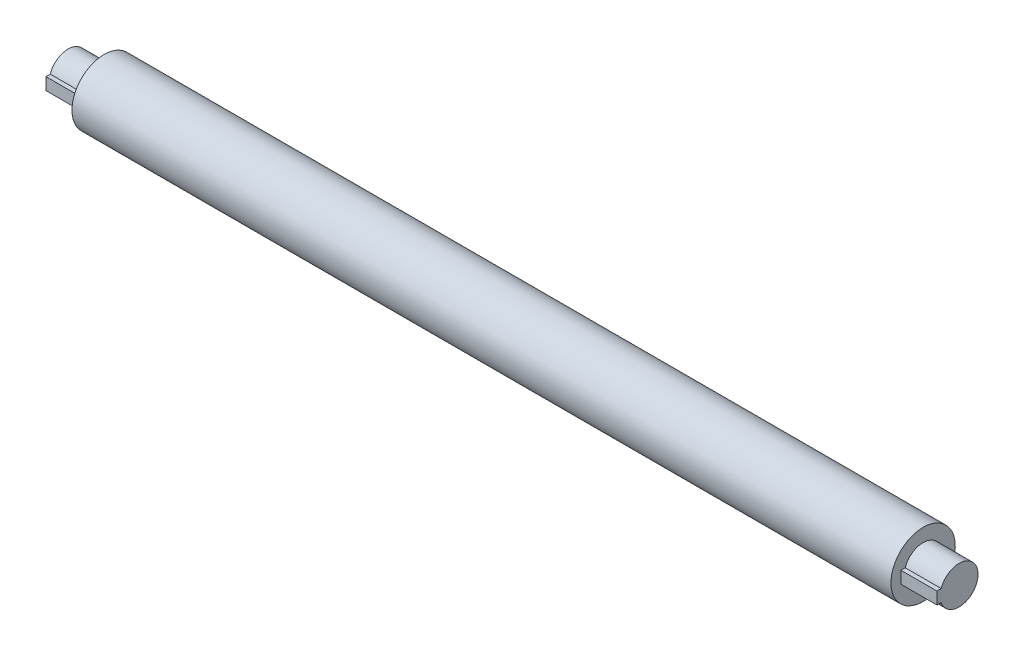
ISO-10303-21;
HEADER;
FILE_DESCRIPTION(('STEP AP214'),'2;1');
FILE_NAME('part.step','',(''),(''),'','','');
FILE_SCHEMA(('AUTOMOTIVE_DESIGN { 1 0 10303 214 1 1 1 1 }'));
ENDSEC;
DATA;
#1=APPLICATION_CONTEXT('core data for automotive mechanical design processes');
#2=APPLICATION_PROTOCOL_DEFINITION('international standard','automotive_design',2000,#1);
#3=PRODUCT_CONTEXT('',#1,'mechanical');
#4=PRODUCT('Part','Part','',(#3));
#5=PRODUCT_RELATED_PRODUCT_CATEGORY('part','',(#4));
#6=PRODUCT_DEFINITION_FORMATION('','',#4);
#7=PRODUCT_DEFINITION_CONTEXT('part definition',#1,'design');
#8=PRODUCT_DEFINITION('design','',#6,#7);
#9=PRODUCT_DEFINITION_SHAPE('','',#8);
#10=(LENGTH_UNIT() NAMED_UNIT(*) SI_UNIT(.MILLI.,.METRE.));
#11=(NAMED_UNIT(*) PLANE_ANGLE_UNIT() SI_UNIT($,.RADIAN.));
#12=(NAMED_UNIT(*) SI_UNIT($,.STERADIAN.) SOLID_ANGLE_UNIT());
#13=UNCERTAINTY_MEASURE_WITH_UNIT(LENGTH_MEASURE(1.E-05),#10,'distance_accuracy_value','');
#14=(GEOMETRIC_REPRESENTATION_CONTEXT(3) GLOBAL_UNCERTAINTY_ASSIGNED_CONTEXT((#13)) GLOBAL_UNIT_ASSIGNED_CONTEXT((#10,
#11,#12)) REPRESENTATION_CONTEXT('',''));
#15=CARTESIAN_POINT('',(0.,0.,0.));
#16=DIRECTION('',(0.,0.,1.));
#17=DIRECTION('',(1.,0.,0.));
#18=AXIS2_PLACEMENT_3D('',#15,#16,#17);
#19=CARTESIAN_POINT('',(-588.665,-1.55039672448655E-13,0.));
#20=DIRECTION('',(-1.,0.,0.));
#21=DIRECTION('',(0.,-1.,0.));
#22=AXIS2_PLACEMENT_3D('',#19,#20,#21);
#23=PLANE('',#22);
#24=CARTESIAN_POINT('',(-588.665,-1.55039672448655E-13,0.));
#25=DIRECTION('',(1.,0.,0.));
#26=DIRECTION('',(0.,1.,0.));
#27=AXIS2_PLACEMENT_3D('',#24,#25,#26);
#28=CIRCLE('',#27,25.);
#29=CARTESIAN_POINT('',(-588.665,-8.00000000000014,23.685438564654));
#30=VERTEX_POINT('',#29);
#31=CARTESIAN_POINT('',(-588.665,7.99999999999985,23.685438564654));
#32=VERTEX_POINT('',#31);
#33=EDGE_CURVE('E11',#30,#32,#28,.T.);
#34=ORIENTED_EDGE('',*,*,#33,.F.);
#35=DIRECTION('',(0.,0.,1.));
#36=VECTOR('',#35,1.);
#37=CARTESIAN_POINT('',(-588.665,-8.,-42.501));
#38=LINE('',#37,#36);
#39=CARTESIAN_POINT('',(-588.665,-8.,29.3));
#40=VERTEX_POINT('',#39);
#41=EDGE_CURVE('E168',#30,#40,#38,.T.);
#42=ORIENTED_EDGE('',*,*,#41,.T.);
#43=DIRECTION('',(0.,-1.,0.));
#44=VECTOR('',#43,1.);
#45=CARTESIAN_POINT('',(-588.665,8.,29.3));
#46=LINE('',#45,#44);
#47=CARTESIAN_POINT('',(-588.665,8.,29.3));
#48=VERTEX_POINT('',#47);
#49=EDGE_CURVE('E152',#48,#40,#46,.T.);
#50=ORIENTED_EDGE('',*,*,#49,.F.);
#51=DIRECTION('',(0.,0.,1.));
#52=VECTOR('',#51,1.);
#53=CARTESIAN_POINT('',(-588.665,8.,-42.501));
#54=LINE('',#53,#52);
#55=EDGE_CURVE('E151',#32,#48,#54,.T.);
#56=ORIENTED_EDGE('',*,*,#55,.F.);
#57=EDGE_LOOP('',(#34,#42,#50,#56));
#58=FACE_BOUND('',#57,.T.);
#59=ADVANCED_FACE('F39',(#58),#23,.T.);
#60=CARTESIAN_POINT('',(588.665,0.,0.));
#61=DIRECTION('',(1.,0.,0.));
#62=DIRECTION('',(0.,1.,0.));
#63=AXIS2_PLACEMENT_3D('',#60,#61,#62);
#64=CYLINDRICAL_SURFACE('',#63,25.);
#65=DIRECTION('',(1.,0.,0.));
#66=VECTOR('',#65,1.);
#67=CARTESIAN_POINT('',(588.665,-8.,23.685438564654));
#68=LINE('',#67,#66);
#69=CARTESIAN_POINT('',(-541.145,-8.00000000000001,23.6854385646541));
#70=VERTEX_POINT('',#69);
#71=EDGE_CURVE('E61',#70,#30,#68,.F.);
#72=ORIENTED_EDGE('',*,*,#71,.T.);
#73=ORIENTED_EDGE('',*,*,#33,.T.);
#74=DIRECTION('',(1.,0.,0.));
#75=VECTOR('',#74,1.);
#76=CARTESIAN_POINT('',(588.665,8.,23.685438564654));
#77=LINE('',#76,#75);
#78=CARTESIAN_POINT('',(-541.145,8.,23.685438564654));
#79=VERTEX_POINT('',#78);
#80=EDGE_CURVE('E147',#32,#79,#77,.T.);
#81=ORIENTED_EDGE('',*,*,#80,.T.);
#82=CARTESIAN_POINT('',(-541.145,-1.49220150859107E-13,0.));
#83=DIRECTION('',(1.,0.,0.));
#84=DIRECTION('',(0.,1.,0.));
#85=AXIS2_PLACEMENT_3D('',#82,#83,#84);
#86=CIRCLE('',#85,25.);
#87=EDGE_CURVE('E47',#70,#79,#86,.T.);
#88=ORIENTED_EDGE('',*,*,#87,.F.);
#89=EDGE_LOOP('',(#72,#73,#81,#88));
#90=FACE_BOUND('',#89,.T.);
#91=ADVANCED_FACE('F201',(#90),#64,.T.);
#92=CARTESIAN_POINT('',(-541.145,24.9999999999998,0.));
#93=DIRECTION('',(-1.,0.,0.));
#94=DIRECTION('',(0.,-1.,0.));
#95=AXIS2_PLACEMENT_3D('',#92,#93,#94);
#96=PLANE('',#95);
#97=DIRECTION('',(0.,0.,1.));
#98=VECTOR('',#97,1.);
#99=CARTESIAN_POINT('',(-541.145,-8.,-42.501));
#100=LINE('',#99,#98);
#101=CARTESIAN_POINT('',(-541.145,-8.,29.3));
#102=VERTEX_POINT('',#101);
#103=EDGE_CURVE('E174',#70,#102,#100,.T.);
#104=ORIENTED_EDGE('',*,*,#103,.F.);
#105=ORIENTED_EDGE('',*,*,#87,.T.);
#106=DIRECTION('',(0.,0.,1.));
#107=VECTOR('',#106,1.);
#108=CARTESIAN_POINT('',(-541.145,8.,-42.501));
#109=LINE('',#108,#107);
#110=CARTESIAN_POINT('',(-541.145,8.,29.3));
#111=VERTEX_POINT('',#110);
#112=EDGE_CURVE('E171',#79,#111,#109,.T.);
#113=ORIENTED_EDGE('',*,*,#112,.T.);
#114=DIRECTION('',(0.,1.,0.));
#115=VECTOR('',#114,1.);
#116=CARTESIAN_POINT('',(-541.145,8.,29.3));
#117=LINE('',#116,#115);
#118=EDGE_CURVE('E160',#102,#111,#117,.T.);
#119=ORIENTED_EDGE('',*,*,#118,.F.);
#120=EDGE_LOOP('',(#104,#105,#113,#119));
#121=FACE_BOUND('',#120,.T.);
#122=CARTESIAN_POINT('',(-541.145,-1.49220150859107E-13,0.));
#123=DIRECTION('',(1.,0.,0.));
#124=DIRECTION('',(0.,1.,0.));
#125=AXIS2_PLACEMENT_3D('',#122,#123,#124);
#126=CIRCLE('',#125,42.5);
#127=CARTESIAN_POINT('',(-541.145,42.4999999999999,0.));
#128=VERTEX_POINT('',#127);
#129=EDGE_CURVE('E192',#128,#128,#126,.T.);
#130=ORIENTED_EDGE('',*,*,#129,.F.);
#131=EDGE_LOOP('',(#130));
#132=FACE_BOUND('',#131,.T.);
#133=ADVANCED_FACE('F197',(#121,#132),#96,.T.);
#134=CARTESIAN_POINT('',(588.665,0.,0.));
#135=DIRECTION('',(1.,0.,0.));
#136=DIRECTION('',(0.,1.,0.));
#137=AXIS2_PLACEMENT_3D('',#134,#135,#136);
#138=CYLINDRICAL_SURFACE('',#137,42.5);
#139=ORIENTED_EDGE('',*,*,#129,.T.);
#140=EDGE_LOOP('',(#139));
#141=FACE_BOUND('',#140,.T.);
#142=CARTESIAN_POINT('',(541.145,0.,0.));
#143=DIRECTION('',(1.,0.,0.));
#144=DIRECTION('',(0.,1.,0.));
#145=AXIS2_PLACEMENT_3D('',#142,#143,#144);
#146=CIRCLE('',#145,42.4999999999999);
#147=CARTESIAN_POINT('',(541.145,42.4999999999999,0.));
#148=VERTEX_POINT('',#147);
#149=EDGE_CURVE('E188',#148,#148,#146,.T.);
#150=ORIENTED_EDGE('',*,*,#149,.F.);
#151=EDGE_LOOP('',(#150));
#152=FACE_BOUND('',#151,.T.);
#153=ADVANCED_FACE('F221',(#141,#152),#138,.T.);
#154=CARTESIAN_POINT('',(541.145,42.4999999999999,0.));
#155=DIRECTION('',(1.,0.,0.));
#156=DIRECTION('',(0.,1.,0.));
#157=AXIS2_PLACEMENT_3D('',#154,#155,#156);
#158=PLANE('',#157);
#159=DIRECTION('',(0.,0.,1.));
#160=VECTOR('',#159,1.);
#161=CARTESIAN_POINT('',(541.145,-7.99999999999987,-42.501));
#162=LINE('',#161,#160);
#163=CARTESIAN_POINT('',(541.145,-7.99999999999987,23.6854385646541));
#164=VERTEX_POINT('',#163);
#165=CARTESIAN_POINT('',(541.145,-7.99999999999987,29.3));
#166=VERTEX_POINT('',#165);
#167=EDGE_CURVE('E117',#164,#166,#162,.T.);
#168=ORIENTED_EDGE('',*,*,#167,.T.);
#169=DIRECTION('',(0.,-1.,0.));
#170=VECTOR('',#169,1.);
#171=CARTESIAN_POINT('',(541.145,8.00000000000013,29.3));
#172=LINE('',#171,#170);
#173=CARTESIAN_POINT('',(541.145,8.00000000000013,29.3));
#174=VERTEX_POINT('',#173);
#175=EDGE_CURVE('E124',#174,#166,#172,.T.);
#176=ORIENTED_EDGE('',*,*,#175,.F.);
#177=DIRECTION('',(0.,0.,1.));
#178=VECTOR('',#177,1.);
#179=CARTESIAN_POINT('',(541.145,8.00000000000013,-42.501));
#180=LINE('',#179,#178);
#181=CARTESIAN_POINT('',(541.145,8.00000000000013,23.685438564654));
#182=VERTEX_POINT('',#181);
#183=EDGE_CURVE('E105',#182,#174,#180,.T.);
#184=ORIENTED_EDGE('',*,*,#183,.F.);
#185=CARTESIAN_POINT('',(541.145,0.,0.));
#186=DIRECTION('',(1.,0.,0.));
#187=DIRECTION('',(0.,1.,0.));
#188=AXIS2_PLACEMENT_3D('',#185,#186,#187);
#189=CIRCLE('',#188,25.);
#190=EDGE_CURVE('E185',#164,#182,#189,.T.);
#191=ORIENTED_EDGE('',*,*,#190,.F.);
#192=EDGE_LOOP('',(#168,#176,#184,#191));
#193=FACE_BOUND('',#192,.T.);
#194=ORIENTED_EDGE('',*,*,#149,.T.);
#195=EDGE_LOOP('',(#194));
#196=FACE_BOUND('',#195,.T.);
#197=ADVANCED_FACE('F128',(#193,#196),#158,.T.);
#198=CARTESIAN_POINT('',(588.665,0.,0.));
#199=DIRECTION('',(1.,0.,0.));
#200=DIRECTION('',(0.,1.,0.));
#201=AXIS2_PLACEMENT_3D('',#198,#199,#200);
#202=CYLINDRICAL_SURFACE('',#201,25.);
#203=DIRECTION('',(1.,0.,0.));
#204=VECTOR('',#203,1.);
#205=CARTESIAN_POINT('',(588.665,-7.99999999999986,23.6854385646541));
#206=LINE('',#205,#204);
#207=CARTESIAN_POINT('',(588.665,-7.99999999999985,23.6854385646541));
#208=VERTEX_POINT('',#207);
#209=EDGE_CURVE('E142',#208,#164,#206,.F.);
#210=ORIENTED_EDGE('',*,*,#209,.T.);
#211=ORIENTED_EDGE('',*,*,#190,.T.);
#212=DIRECTION('',(1.,0.,0.));
#213=VECTOR('',#212,1.);
#214=CARTESIAN_POINT('',(588.665,8.00000000000014,23.685438564654));
#215=LINE('',#214,#213);
#216=CARTESIAN_POINT('',(588.665,8.00000000000014,23.685438564654));
#217=VERTEX_POINT('',#216);
#218=EDGE_CURVE('E111',#182,#217,#215,.T.);
#219=ORIENTED_EDGE('',*,*,#218,.T.);
#220=CARTESIAN_POINT('',(588.665,0.,0.));
#221=DIRECTION('',(1.,0.,0.));
#222=DIRECTION('',(0.,1.,0.));
#223=AXIS2_PLACEMENT_3D('',#220,#221,#222);
#224=CIRCLE('',#223,25.);
#225=EDGE_CURVE('E182',#208,#217,#224,.T.);
#226=ORIENTED_EDGE('',*,*,#225,.F.);
#227=EDGE_LOOP('',(#210,#211,#219,#226));
#228=FACE_BOUND('',#227,.T.);
#229=ADVANCED_FACE('F229',(#228),#202,.T.);
#230=CARTESIAN_POINT('',(588.665,25.,0.));
#231=DIRECTION('',(1.,0.,0.));
#232=DIRECTION('',(0.,1.,0.));
#233=AXIS2_PLACEMENT_3D('',#230,#231,#232);
#234=PLANE('',#233);
#235=ORIENTED_EDGE('',*,*,#225,.T.);
#236=DIRECTION('',(0.,0.,1.));
#237=VECTOR('',#236,1.);
#238=CARTESIAN_POINT('',(588.665,8.00000000000014,-42.501));
#239=LINE('',#238,#237);
#240=CARTESIAN_POINT('',(588.665,8.00000000000014,29.3));
#241=VERTEX_POINT('',#240);
#242=EDGE_CURVE('E139',#217,#241,#239,.T.);
#243=ORIENTED_EDGE('',*,*,#242,.T.);
#244=DIRECTION('',(0.,1.,0.));
#245=VECTOR('',#244,1.);
#246=CARTESIAN_POINT('',(588.665,8.00000000000014,29.3));
#247=LINE('',#246,#245);
#248=CARTESIAN_POINT('',(588.665,-7.99999999999986,29.3));
#249=VERTEX_POINT('',#248);
#250=EDGE_CURVE('E118',#249,#241,#247,.T.);
#251=ORIENTED_EDGE('',*,*,#250,.F.);
#252=DIRECTION('',(0.,0.,1.));
#253=VECTOR('',#252,1.);
#254=CARTESIAN_POINT('',(588.665,-7.99999999999986,-42.501));
#255=LINE('',#254,#253);
#256=EDGE_CURVE('E54',#208,#249,#255,.T.);
#257=ORIENTED_EDGE('',*,*,#256,.F.);
#258=EDGE_LOOP('',(#235,#243,#251,#257));
#259=FACE_BOUND('',#258,.T.);
#260=ADVANCED_FACE('F232',(#259),#234,.T.);
#261=CARTESIAN_POINT('',(0.,0.,29.3));
#262=DIRECTION('',(0.,0.,1.));
#263=DIRECTION('',(1.,0.,0.));
#264=AXIS2_PLACEMENT_3D('',#261,#262,#263);
#265=PLANE('',#264);
#266=ORIENTED_EDGE('',*,*,#49,.T.);
#267=DIRECTION('',(1.,0.,0.));
#268=VECTOR('',#267,1.);
#269=CARTESIAN_POINT('',(-588.665,-8.,29.3));
#270=LINE('',#269,#268);
#271=EDGE_CURVE('E156',#40,#102,#270,.T.);
#272=ORIENTED_EDGE('',*,*,#271,.T.);
#273=ORIENTED_EDGE('',*,*,#118,.T.);
#274=DIRECTION('',(-1.,0.,0.));
#275=VECTOR('',#274,1.);
#276=CARTESIAN_POINT('',(-588.665,8.,29.3));
#277=LINE('',#276,#275);
#278=EDGE_CURVE('E164',#111,#48,#277,.T.);
#279=ORIENTED_EDGE('',*,*,#278,.T.);
#280=EDGE_LOOP('',(#266,#272,#273,#279));
#281=FACE_BOUND('',#280,.T.);
#282=ADVANCED_FACE('F208',(#281),#265,.T.);
#283=CARTESIAN_POINT('',(-588.665,-8.,-42.501));
#284=DIRECTION('',(0.,-1.,0.));
#285=DIRECTION('',(0.,0.,-1.));
#286=AXIS2_PLACEMENT_3D('',#283,#284,#285);
#287=PLANE('',#286);
#288=ORIENTED_EDGE('',*,*,#71,.F.);
#289=ORIENTED_EDGE('',*,*,#103,.T.);
#290=ORIENTED_EDGE('',*,*,#271,.F.);
#291=ORIENTED_EDGE('',*,*,#41,.F.);
#292=EDGE_LOOP('',(#288,#289,#290,#291));
#293=FACE_BOUND('',#292,.T.);
#294=ADVANCED_FACE('F211',(#293),#287,.T.);
#295=CARTESIAN_POINT('',(-588.665,8.,-42.501));
#296=DIRECTION('',(0.,1.,0.));
#297=DIRECTION('',(0.,0.,1.));
#298=AXIS2_PLACEMENT_3D('',#295,#296,#297);
#299=PLANE('',#298);
#300=ORIENTED_EDGE('',*,*,#80,.F.);
#301=ORIENTED_EDGE('',*,*,#55,.T.);
#302=ORIENTED_EDGE('',*,*,#278,.F.);
#303=ORIENTED_EDGE('',*,*,#112,.F.);
#304=EDGE_LOOP('',(#300,#301,#302,#303));
#305=FACE_BOUND('',#304,.T.);
#306=ADVANCED_FACE('F205',(#305),#299,.T.);
#307=CARTESIAN_POINT('',(0.,0.,29.3));
#308=DIRECTION('',(0.,0.,1.));
#309=DIRECTION('',(1.,0.,0.));
#310=AXIS2_PLACEMENT_3D('',#307,#308,#309);
#311=PLANE('',#310);
#312=DIRECTION('',(-1.,0.,0.));
#313=VECTOR('',#312,1.);
#314=CARTESIAN_POINT('',(588.665,8.00000000000014,29.3));
#315=LINE('',#314,#313);
#316=EDGE_CURVE('E108',#241,#174,#315,.T.);
#317=ORIENTED_EDGE('',*,*,#316,.T.);
#318=ORIENTED_EDGE('',*,*,#175,.T.);
#319=DIRECTION('',(1.,0.,0.));
#320=VECTOR('',#319,1.);
#321=CARTESIAN_POINT('',(588.665,-7.99999999999986,29.3));
#322=LINE('',#321,#320);
#323=EDGE_CURVE('E131',#166,#249,#322,.T.);
#324=ORIENTED_EDGE('',*,*,#323,.T.);
#325=ORIENTED_EDGE('',*,*,#250,.T.);
#326=EDGE_LOOP('',(#317,#318,#324,#325));
#327=FACE_BOUND('',#326,.T.);
#328=ADVANCED_FACE('F122',(#327),#311,.T.);
#329=CARTESIAN_POINT('',(588.665,-7.99999999999986,-42.501));
#330=DIRECTION('',(0.,-1.,0.));
#331=DIRECTION('',(1.,0.,0.));
#332=AXIS2_PLACEMENT_3D('',#329,#330,#331);
#333=PLANE('',#332);
#334=ORIENTED_EDGE('',*,*,#209,.F.);
#335=ORIENTED_EDGE('',*,*,#256,.T.);
#336=ORIENTED_EDGE('',*,*,#323,.F.);
#337=ORIENTED_EDGE('',*,*,#167,.F.);
#338=EDGE_LOOP('',(#334,#335,#336,#337));
#339=FACE_BOUND('',#338,.T.);
#340=ADVANCED_FACE('F244',(#339),#333,.T.);
#341=CARTESIAN_POINT('',(588.665,8.00000000000014,-42.501));
#342=DIRECTION('',(0.,1.,0.));
#343=DIRECTION('',(-1.,0.,0.));
#344=AXIS2_PLACEMENT_3D('',#341,#342,#343);
#345=PLANE('',#344);
#346=ORIENTED_EDGE('',*,*,#218,.F.);
#347=ORIENTED_EDGE('',*,*,#183,.T.);
#348=ORIENTED_EDGE('',*,*,#316,.F.);
#349=ORIENTED_EDGE('',*,*,#242,.F.);
#350=EDGE_LOOP('',(#346,#347,#348,#349));
#351=FACE_BOUND('',#350,.T.);
#352=ADVANCED_FACE('F107',(#351),#345,.T.);
#353=CLOSED_SHELL('',(#59,#91,#133,#153,#197,#229,#260,#282,#294,#306,#328,#340,#352));
#354=MANIFOLD_SOLID_BREP('B2',#353);
#355=ADVANCED_BREP_SHAPE_REPRESENTATION('',(#18,#354),#14);
#356=SHAPE_DEFINITION_REPRESENTATION(#9,#355);
ENDSEC;
END-ISO-10303-21;
